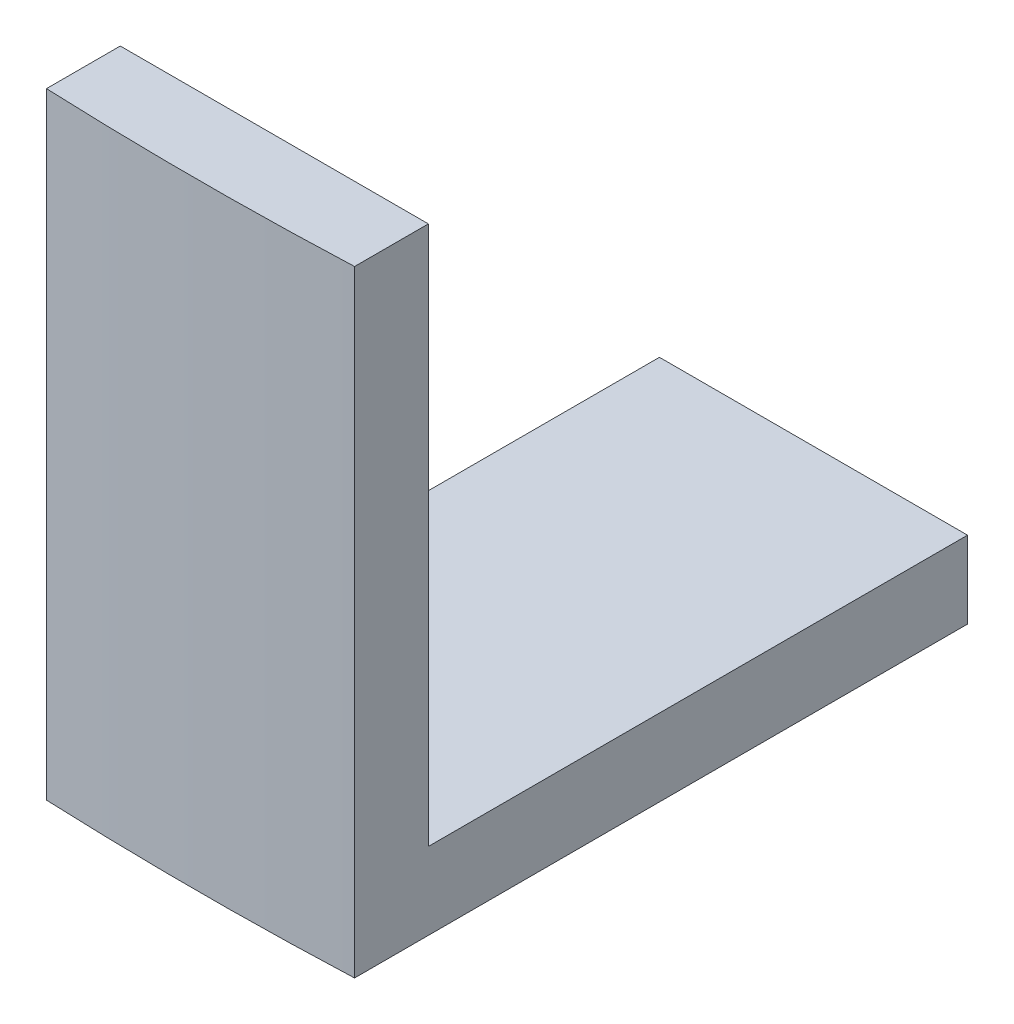
ISO-10303-21;
HEADER;
FILE_DESCRIPTION(('STEP AP214'),'2;1');
FILE_NAME('part.step','',(''),(''),'','','');
FILE_SCHEMA(('AUTOMOTIVE_DESIGN { 1 0 10303 214 1 1 1 1 }'));
ENDSEC;
DATA;
#1=APPLICATION_CONTEXT('core data for automotive mechanical design processes');
#2=APPLICATION_PROTOCOL_DEFINITION('international standard','automotive_design',2000,#1);
#3=PRODUCT_CONTEXT('',#1,'mechanical');
#4=PRODUCT('Part','Part','',(#3));
#5=PRODUCT_RELATED_PRODUCT_CATEGORY('part','',(#4));
#6=PRODUCT_DEFINITION_FORMATION('','',#4);
#7=PRODUCT_DEFINITION_CONTEXT('part definition',#1,'design');
#8=PRODUCT_DEFINITION('design','',#6,#7);
#9=PRODUCT_DEFINITION_SHAPE('','',#8);
#10=(LENGTH_UNIT() NAMED_UNIT(*) SI_UNIT(.MILLI.,.METRE.));
#11=(NAMED_UNIT(*) PLANE_ANGLE_UNIT() SI_UNIT($,.RADIAN.));
#12=(NAMED_UNIT(*) SI_UNIT($,.STERADIAN.) SOLID_ANGLE_UNIT());
#13=UNCERTAINTY_MEASURE_WITH_UNIT(LENGTH_MEASURE(1.E-05),#10,'distance_accuracy_value','');
#14=(GEOMETRIC_REPRESENTATION_CONTEXT(3) GLOBAL_UNCERTAINTY_ASSIGNED_CONTEXT((#13)) GLOBAL_UNIT_ASSIGNED_CONTEXT((#10,
#11,#12)) REPRESENTATION_CONTEXT('',''));
#15=CARTESIAN_POINT('',(0.,0.,0.));
#16=DIRECTION('',(0.,0.,1.));
#17=DIRECTION('',(1.,0.,0.));
#18=AXIS2_PLACEMENT_3D('',#15,#16,#17);
#19=CARTESIAN_POINT('',(6.35,0.,0.));
#20=DIRECTION('',(0.,1.,0.));
#21=DIRECTION('',(0.,0.,1.));
#22=AXIS2_PLACEMENT_3D('',#19,#20,#21);
#23=PLANE('',#22);
#24=DIRECTION('',(0.,0.,-1.));
#25=VECTOR('',#24,1.);
#26=CARTESIAN_POINT('',(6.35,0.,0.));
#27=LINE('',#26,#25);
#28=CARTESIAN_POINT('',(6.35,0.,-0.0661745674106623));
#29=VERTEX_POINT('',#28);
#30=CARTESIAN_POINT('',(6.35,0.,-12.7));
#31=VERTEX_POINT('',#30);
#32=EDGE_CURVE('E84',#29,#31,#27,.T.);
#33=ORIENTED_EDGE('',*,*,#32,.F.);
#34=CARTESIAN_POINT('',(3.175,4.16333634234434E-13,-76.2000000000001));
#35=DIRECTION('',(0.,1.,0.));
#36=DIRECTION('',(0.,0.,1.));
#37=AXIS2_PLACEMENT_3D('',#34,#35,#36);
#38=CIRCLE('',#37,76.2);
#39=CARTESIAN_POINT('',(0.,0.,-0.0661745674106623));
#40=VERTEX_POINT('',#39);
#41=EDGE_CURVE('E93',#40,#29,#38,.T.);
#42=ORIENTED_EDGE('',*,*,#41,.F.);
#43=DIRECTION('',(0.,0.,-1.));
#44=VECTOR('',#43,1.);
#45=CARTESIAN_POINT('',(0.,0.,0.));
#46=LINE('',#45,#44);
#47=CARTESIAN_POINT('',(0.,0.,-12.7));
#48=VERTEX_POINT('',#47);
#49=EDGE_CURVE('E102',#40,#48,#46,.T.);
#50=ORIENTED_EDGE('',*,*,#49,.T.);
#51=DIRECTION('',(-1.,0.,0.));
#52=VECTOR('',#51,1.);
#53=CARTESIAN_POINT('',(6.35,0.,-12.7));
#54=LINE('',#53,#52);
#55=EDGE_CURVE('E41',#31,#48,#54,.T.);
#56=ORIENTED_EDGE('',*,*,#55,.F.);
#57=EDGE_LOOP('',(#33,#42,#50,#56));
#58=FACE_BOUND('',#57,.T.);
#59=ADVANCED_FACE('F34',(#58),#23,.F.);
#60=CARTESIAN_POINT('',(6.35,12.7,-1.5875));
#61=DIRECTION('',(0.,-1.,0.));
#62=DIRECTION('',(0.,0.,-1.));
#63=AXIS2_PLACEMENT_3D('',#60,#61,#62);
#64=PLANE('',#63);
#65=CARTESIAN_POINT('',(3.175,12.7000000000005,-76.2));
#66=DIRECTION('',(0.,1.,0.));
#67=DIRECTION('',(0.,0.,1.));
#68=AXIS2_PLACEMENT_3D('',#65,#66,#67);
#69=CIRCLE('',#68,76.2);
#70=CARTESIAN_POINT('',(0.,12.7,-0.0661745674106207));
#71=VERTEX_POINT('',#70);
#72=CARTESIAN_POINT('',(6.35,12.7,-0.0661745674105929));
#73=VERTEX_POINT('',#72);
#74=EDGE_CURVE('E47',#71,#73,#69,.T.);
#75=ORIENTED_EDGE('',*,*,#74,.T.);
#76=DIRECTION('',(0.,0.,1.));
#77=VECTOR('',#76,1.);
#78=CARTESIAN_POINT('',(6.35,12.7,-1.5875));
#79=LINE('',#78,#77);
#80=CARTESIAN_POINT('',(6.35,12.7,-1.5875));
#81=VERTEX_POINT('',#80);
#82=EDGE_CURVE('E101',#81,#73,#79,.T.);
#83=ORIENTED_EDGE('',*,*,#82,.F.);
#84=DIRECTION('',(-1.,0.,0.));
#85=VECTOR('',#84,1.);
#86=CARTESIAN_POINT('',(6.35,12.7,-1.5875));
#87=LINE('',#86,#85);
#88=CARTESIAN_POINT('',(0.,12.7,-1.5875));
#89=VERTEX_POINT('',#88);
#90=EDGE_CURVE('E118',#81,#89,#87,.T.);
#91=ORIENTED_EDGE('',*,*,#90,.T.);
#92=DIRECTION('',(0.,0.,1.));
#93=VECTOR('',#92,1.);
#94=CARTESIAN_POINT('',(0.,12.7,-1.5875));
#95=LINE('',#94,#93);
#96=EDGE_CURVE('E107',#89,#71,#95,.T.);
#97=ORIENTED_EDGE('',*,*,#96,.T.);
#98=EDGE_LOOP('',(#75,#83,#91,#97));
#99=FACE_BOUND('',#98,.T.);
#100=ADVANCED_FACE('F144',(#99),#64,.F.);
#101=CARTESIAN_POINT('',(6.35,0.,0.));
#102=DIRECTION('',(1.,0.,0.));
#103=DIRECTION('',(0.,0.,-1.));
#104=AXIS2_PLACEMENT_3D('',#101,#102,#103);
#105=PLANE('',#104);
#106=ORIENTED_EDGE('',*,*,#82,.T.);
#107=DIRECTION('',(0.,1.,0.));
#108=VECTOR('',#107,1.);
#109=CARTESIAN_POINT('',(6.35,0.,-0.0661745674106623));
#110=LINE('',#109,#108);
#111=EDGE_CURVE('E95',#73,#29,#110,.F.);
#112=ORIENTED_EDGE('',*,*,#111,.T.);
#113=ORIENTED_EDGE('',*,*,#32,.T.);
#114=DIRECTION('',(0.,1.,0.));
#115=VECTOR('',#114,1.);
#116=CARTESIAN_POINT('',(6.35,0.,-12.7));
#117=LINE('',#116,#115);
#118=CARTESIAN_POINT('',(6.35,1.5875,-12.7));
#119=VERTEX_POINT('',#118);
#120=EDGE_CURVE('E106',#31,#119,#117,.T.);
#121=ORIENTED_EDGE('',*,*,#120,.T.);
#122=DIRECTION('',(0.,0.,1.));
#123=VECTOR('',#122,1.);
#124=CARTESIAN_POINT('',(6.35,1.5875,-12.7));
#125=LINE('',#124,#123);
#126=CARTESIAN_POINT('',(6.35,1.5875,-1.5875));
#127=VERTEX_POINT('',#126);
#128=EDGE_CURVE('E109',#119,#127,#125,.T.);
#129=ORIENTED_EDGE('',*,*,#128,.T.);
#130=DIRECTION('',(0.,1.,0.));
#131=VECTOR('',#130,1.);
#132=CARTESIAN_POINT('',(6.35,1.5875,-1.5875));
#133=LINE('',#132,#131);
#134=EDGE_CURVE('E56',#127,#81,#133,.T.);
#135=ORIENTED_EDGE('',*,*,#134,.T.);
#136=EDGE_LOOP('',(#106,#112,#113,#121,#129,#135));
#137=FACE_BOUND('',#136,.T.);
#138=ADVANCED_FACE('F99',(#137),#105,.T.);
#139=CARTESIAN_POINT('',(0.,0.,0.));
#140=DIRECTION('',(1.,0.,0.));
#141=DIRECTION('',(0.,0.,-1.));
#142=AXIS2_PLACEMENT_3D('',#139,#140,#141);
#143=PLANE('',#142);
#144=DIRECTION('',(0.,1.,0.));
#145=VECTOR('',#144,1.);
#146=CARTESIAN_POINT('',(0.,0.,-0.0661745674106623));
#147=LINE('',#146,#145);
#148=EDGE_CURVE('E12',#71,#40,#147,.F.);
#149=ORIENTED_EDGE('',*,*,#148,.F.);
#150=ORIENTED_EDGE('',*,*,#96,.F.);
#151=DIRECTION('',(0.,1.,0.));
#152=VECTOR('',#151,1.);
#153=CARTESIAN_POINT('',(0.,1.5875,-1.5875));
#154=LINE('',#153,#152);
#155=CARTESIAN_POINT('',(0.,1.5875,-1.5875));
#156=VERTEX_POINT('',#155);
#157=EDGE_CURVE('E77',#156,#89,#154,.T.);
#158=ORIENTED_EDGE('',*,*,#157,.F.);
#159=DIRECTION('',(0.,0.,1.));
#160=VECTOR('',#159,1.);
#161=CARTESIAN_POINT('',(0.,1.5875,-12.7));
#162=LINE('',#161,#160);
#163=CARTESIAN_POINT('',(0.,1.5875,-12.7));
#164=VERTEX_POINT('',#163);
#165=EDGE_CURVE('E122',#164,#156,#162,.T.);
#166=ORIENTED_EDGE('',*,*,#165,.F.);
#167=DIRECTION('',(0.,1.,0.));
#168=VECTOR('',#167,1.);
#169=CARTESIAN_POINT('',(0.,0.,-12.7));
#170=LINE('',#169,#168);
#171=EDGE_CURVE('E120',#48,#164,#170,.T.);
#172=ORIENTED_EDGE('',*,*,#171,.F.);
#173=ORIENTED_EDGE('',*,*,#49,.F.);
#174=EDGE_LOOP('',(#149,#150,#158,#166,#172,#173));
#175=FACE_BOUND('',#174,.T.);
#176=ADVANCED_FACE('F136',(#175),#143,.F.);
#177=CARTESIAN_POINT('',(6.35,0.,-12.7));
#178=DIRECTION('',(0.,0.,1.));
#179=DIRECTION('',(1.,0.,0.));
#180=AXIS2_PLACEMENT_3D('',#177,#178,#179);
#181=PLANE('',#180);
#182=ORIENTED_EDGE('',*,*,#171,.T.);
#183=DIRECTION('',(-1.,0.,0.));
#184=VECTOR('',#183,1.);
#185=CARTESIAN_POINT('',(6.35,1.5875,-12.7));
#186=LINE('',#185,#184);
#187=EDGE_CURVE('E128',#119,#164,#186,.T.);
#188=ORIENTED_EDGE('',*,*,#187,.F.);
#189=ORIENTED_EDGE('',*,*,#120,.F.);
#190=ORIENTED_EDGE('',*,*,#55,.T.);
#191=EDGE_LOOP('',(#182,#188,#189,#190));
#192=FACE_BOUND('',#191,.T.);
#193=ADVANCED_FACE('F132',(#192),#181,.F.);
#194=CARTESIAN_POINT('',(6.35,1.5875,-12.7));
#195=DIRECTION('',(0.,-1.,0.));
#196=DIRECTION('',(0.,0.,-1.));
#197=AXIS2_PLACEMENT_3D('',#194,#195,#196);
#198=PLANE('',#197);
#199=ORIENTED_EDGE('',*,*,#165,.T.);
#200=DIRECTION('',(-1.,0.,0.));
#201=VECTOR('',#200,1.);
#202=CARTESIAN_POINT('',(6.35,1.5875,-1.5875));
#203=LINE('',#202,#201);
#204=EDGE_CURVE('E126',#127,#156,#203,.T.);
#205=ORIENTED_EDGE('',*,*,#204,.F.);
#206=ORIENTED_EDGE('',*,*,#128,.F.);
#207=ORIENTED_EDGE('',*,*,#187,.T.);
#208=EDGE_LOOP('',(#199,#205,#206,#207));
#209=FACE_BOUND('',#208,.T.);
#210=ADVANCED_FACE('F140',(#209),#198,.F.);
#211=CARTESIAN_POINT('',(6.35,1.5875,-1.5875));
#212=DIRECTION('',(0.,0.,1.));
#213=DIRECTION('',(0.,-1.,0.));
#214=AXIS2_PLACEMENT_3D('',#211,#212,#213);
#215=PLANE('',#214);
#216=ORIENTED_EDGE('',*,*,#157,.T.);
#217=ORIENTED_EDGE('',*,*,#90,.F.);
#218=ORIENTED_EDGE('',*,*,#134,.F.);
#219=ORIENTED_EDGE('',*,*,#204,.T.);
#220=EDGE_LOOP('',(#216,#217,#218,#219));
#221=FACE_BOUND('',#220,.T.);
#222=ADVANCED_FACE('F142',(#221),#215,.F.);
#223=CARTESIAN_POINT('',(3.175,4.16333634234434E-13,-76.2000000000001));
#224=DIRECTION('',(0.,1.,0.));
#225=DIRECTION('',(0.,0.,1.));
#226=AXIS2_PLACEMENT_3D('',#223,#224,#225);
#227=CYLINDRICAL_SURFACE('',#226,76.2);
#228=ORIENTED_EDGE('',*,*,#41,.T.);
#229=ORIENTED_EDGE('',*,*,#111,.F.);
#230=ORIENTED_EDGE('',*,*,#74,.F.);
#231=ORIENTED_EDGE('',*,*,#148,.T.);
#232=EDGE_LOOP('',(#228,#229,#230,#231));
#233=FACE_BOUND('',#232,.T.);
#234=ADVANCED_FACE('F94',(#233),#227,.T.);
#235=CLOSED_SHELL('',(#59,#100,#138,#176,#193,#210,#222,#234));
#236=MANIFOLD_SOLID_BREP('B2',#235);
#237=ADVANCED_BREP_SHAPE_REPRESENTATION('',(#18,#236),#14);
#238=SHAPE_DEFINITION_REPRESENTATION(#9,#237);
ENDSEC;
END-ISO-10303-21;
